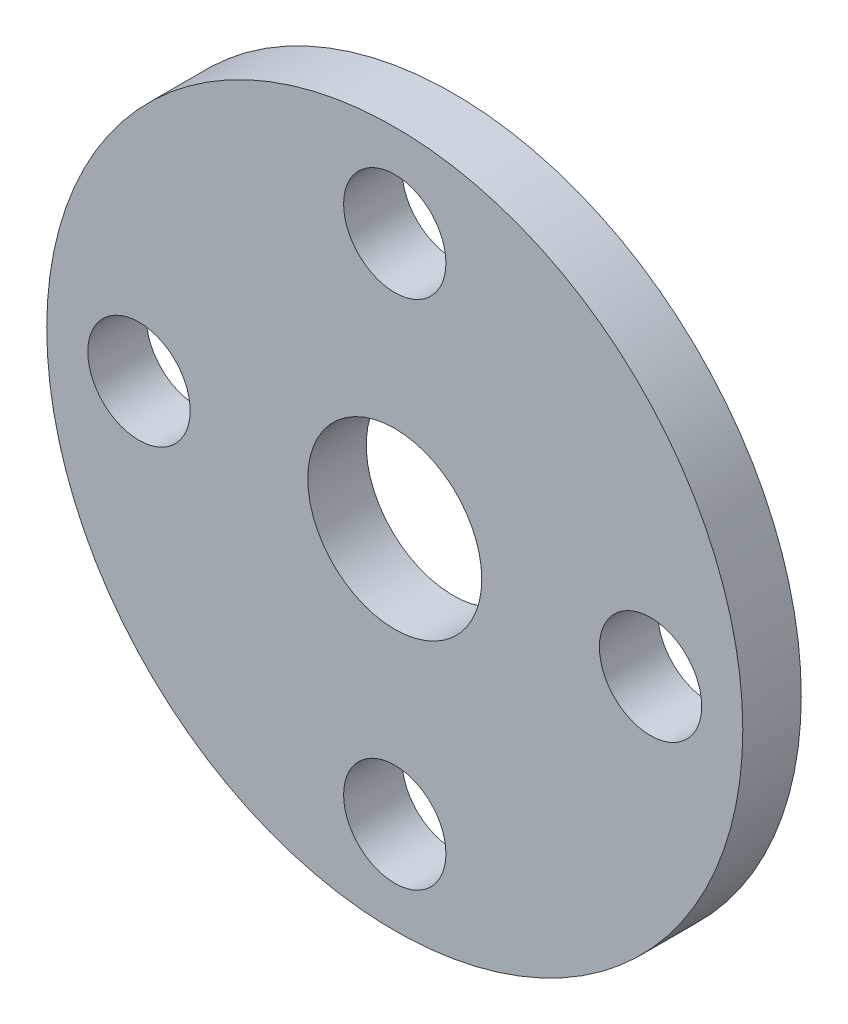
ISO-10303-21;
HEADER;
FILE_DESCRIPTION(('STEP AP214'),'2;1');
FILE_NAME('part.step','',(''),(''),'','','');
FILE_SCHEMA(('AUTOMOTIVE_DESIGN { 1 0 10303 214 1 1 1 1 }'));
ENDSEC;
DATA;
#1=APPLICATION_CONTEXT('core data for automotive mechanical design processes');
#2=APPLICATION_PROTOCOL_DEFINITION('international standard','automotive_design',2000,#1);
#3=PRODUCT_CONTEXT('',#1,'mechanical');
#4=PRODUCT('Part','Part','',(#3));
#5=PRODUCT_RELATED_PRODUCT_CATEGORY('part','',(#4));
#6=PRODUCT_DEFINITION_FORMATION('','',#4);
#7=PRODUCT_DEFINITION_CONTEXT('part definition',#1,'design');
#8=PRODUCT_DEFINITION('design','',#6,#7);
#9=PRODUCT_DEFINITION_SHAPE('','',#8);
#10=(LENGTH_UNIT() NAMED_UNIT(*) SI_UNIT(.MILLI.,.METRE.));
#11=(NAMED_UNIT(*) PLANE_ANGLE_UNIT() SI_UNIT($,.RADIAN.));
#12=(NAMED_UNIT(*) SI_UNIT($,.STERADIAN.) SOLID_ANGLE_UNIT());
#13=UNCERTAINTY_MEASURE_WITH_UNIT(LENGTH_MEASURE(1.E-05),#10,'distance_accuracy_value','');
#14=(GEOMETRIC_REPRESENTATION_CONTEXT(3) GLOBAL_UNCERTAINTY_ASSIGNED_CONTEXT((#13)) GLOBAL_UNIT_ASSIGNED_CONTEXT((#10,
#11,#12)) REPRESENTATION_CONTEXT('',''));
#15=CARTESIAN_POINT('',(0.,0.,0.));
#16=DIRECTION('',(0.,0.,1.));
#17=DIRECTION('',(1.,0.,0.));
#18=AXIS2_PLACEMENT_3D('',#15,#16,#17);
#19=CARTESIAN_POINT('',(0.,0.,-4.7498));
#20=DIRECTION('',(0.,0.,-1.));
#21=DIRECTION('',(-1.,0.,0.));
#22=AXIS2_PLACEMENT_3D('',#19,#20,#21);
#23=PLANE('',#22);
#24=CARTESIAN_POINT('',(0.,0.,-4.7498));
#25=DIRECTION('',(0.,0.,-1.));
#26=DIRECTION('',(-1.,0.,0.));
#27=AXIS2_PLACEMENT_3D('',#24,#25,#26);
#28=CIRCLE('',#27,9.525);
#29=CARTESIAN_POINT('',(-9.525,0.,-4.7498));
#30=VERTEX_POINT('',#29);
#31=EDGE_CURVE('E60',#30,#30,#28,.T.);
#32=ORIENTED_EDGE('',*,*,#31,.F.);
#33=EDGE_LOOP('',(#32));
#34=FACE_BOUND('',#33,.T.);
#35=CARTESIAN_POINT('',(0.,0.,-4.7498));
#36=DIRECTION('',(0.,0.,-1.));
#37=DIRECTION('',(-1.,0.,0.));
#38=AXIS2_PLACEMENT_3D('',#35,#36,#37);
#39=CIRCLE('',#38,2.38125);
#40=CARTESIAN_POINT('',(-2.38125,0.,-4.7498));
#41=VERTEX_POINT('',#40);
#42=EDGE_CURVE('E70',#41,#41,#39,.T.);
#43=ORIENTED_EDGE('',*,*,#42,.T.);
#44=EDGE_LOOP('',(#43));
#45=FACE_BOUND('',#44,.T.);
#46=CARTESIAN_POINT('',(0.,-7.,-4.7498));
#47=DIRECTION('',(0.,0.,-1.));
#48=DIRECTION('',(-1.,0.,0.));
#49=AXIS2_PLACEMENT_3D('',#46,#47,#48);
#50=CIRCLE('',#49,1.4);
#51=CARTESIAN_POINT('',(-1.4,-7.,-4.7498));
#52=VERTEX_POINT('',#51);
#53=EDGE_CURVE('E73',#52,#52,#50,.T.);
#54=ORIENTED_EDGE('',*,*,#53,.T.);
#55=EDGE_LOOP('',(#54));
#56=FACE_BOUND('',#55,.T.);
#57=CARTESIAN_POINT('',(7.,0.,-4.7498));
#58=DIRECTION('',(0.,0.,-1.));
#59=DIRECTION('',(-1.,0.,0.));
#60=AXIS2_PLACEMENT_3D('',#57,#58,#59);
#61=CIRCLE('',#60,1.4);
#62=CARTESIAN_POINT('',(5.6,0.,-4.7498));
#63=VERTEX_POINT('',#62);
#64=EDGE_CURVE('E76',#63,#63,#61,.T.);
#65=ORIENTED_EDGE('',*,*,#64,.T.);
#66=EDGE_LOOP('',(#65));
#67=FACE_BOUND('',#66,.T.);
#68=CARTESIAN_POINT('',(0.,7.,-4.7498));
#69=DIRECTION('',(0.,0.,-1.));
#70=DIRECTION('',(-1.,0.,0.));
#71=AXIS2_PLACEMENT_3D('',#68,#69,#70);
#72=CIRCLE('',#71,1.4);
#73=CARTESIAN_POINT('',(-1.4,7.,-4.7498));
#74=VERTEX_POINT('',#73);
#75=EDGE_CURVE('E79',#74,#74,#72,.T.);
#76=ORIENTED_EDGE('',*,*,#75,.T.);
#77=EDGE_LOOP('',(#76));
#78=FACE_BOUND('',#77,.T.);
#79=CARTESIAN_POINT('',(-7.,0.,-4.7498));
#80=DIRECTION('',(0.,0.,-1.));
#81=DIRECTION('',(-1.,0.,0.));
#82=AXIS2_PLACEMENT_3D('',#79,#80,#81);
#83=CIRCLE('',#82,1.4);
#84=CARTESIAN_POINT('',(-8.4,0.,-4.7498));
#85=VERTEX_POINT('',#84);
#86=EDGE_CURVE('E68',#85,#85,#83,.T.);
#87=ORIENTED_EDGE('',*,*,#86,.T.);
#88=EDGE_LOOP('',(#87));
#89=FACE_BOUND('',#88,.T.);
#90=ADVANCED_FACE('F35',(#34,#45,#56,#67,#78,#89),#23,.F.);
#91=CARTESIAN_POINT('',(0.,0.,-33.2907683632075));
#92=DIRECTION('',(0.,0.,1.));
#93=DIRECTION('',(1.,0.,0.));
#94=AXIS2_PLACEMENT_3D('',#91,#92,#93);
#95=CYLINDRICAL_SURFACE('',#94,9.525);
#96=CARTESIAN_POINT('',(0.,0.,-6.35));
#97=DIRECTION('',(0.,0.,1.));
#98=DIRECTION('',(1.,0.,0.));
#99=AXIS2_PLACEMENT_3D('',#96,#97,#98);
#100=CIRCLE('',#99,9.525);
#101=CARTESIAN_POINT('',(9.525,0.,-6.35));
#102=VERTEX_POINT('',#101);
#103=EDGE_CURVE('E51',#102,#102,#100,.T.);
#104=ORIENTED_EDGE('',*,*,#103,.T.);
#105=EDGE_LOOP('',(#104));
#106=FACE_BOUND('',#105,.T.);
#107=ORIENTED_EDGE('',*,*,#31,.T.);
#108=EDGE_LOOP('',(#107));
#109=FACE_BOUND('',#108,.T.);
#110=ADVANCED_FACE('F97',(#106,#109),#95,.T.);
#111=CARTESIAN_POINT('',(0.,0.,-33.2907683632075));
#112=DIRECTION('',(0.,0.,1.));
#113=DIRECTION('',(1.,0.,0.));
#114=AXIS2_PLACEMENT_3D('',#111,#112,#113);
#115=CYLINDRICAL_SURFACE('',#114,2.38125);
#116=CARTESIAN_POINT('',(0.,0.,-6.35));
#117=DIRECTION('',(0.,0.,1.));
#118=DIRECTION('',(1.,0.,0.));
#119=AXIS2_PLACEMENT_3D('',#116,#117,#118);
#120=CIRCLE('',#119,2.38125);
#121=CARTESIAN_POINT('',(2.38125,0.,-6.35));
#122=VERTEX_POINT('',#121);
#123=EDGE_CURVE('E10',#122,#122,#120,.T.);
#124=ORIENTED_EDGE('',*,*,#123,.F.);
#125=EDGE_LOOP('',(#124));
#126=FACE_BOUND('',#125,.T.);
#127=ORIENTED_EDGE('',*,*,#42,.F.);
#128=EDGE_LOOP('',(#127));
#129=FACE_BOUND('',#128,.T.);
#130=ADVANCED_FACE('F103',(#126,#129),#115,.F.);
#131=CARTESIAN_POINT('',(0.,-7.,-33.2907683632075));
#132=DIRECTION('',(0.,0.,1.));
#133=DIRECTION('',(1.,0.,0.));
#134=AXIS2_PLACEMENT_3D('',#131,#132,#133);
#135=CYLINDRICAL_SURFACE('',#134,1.4);
#136=CARTESIAN_POINT('',(0.,-7.,-6.35));
#137=DIRECTION('',(0.,0.,1.));
#138=DIRECTION('',(1.,0.,0.));
#139=AXIS2_PLACEMENT_3D('',#136,#137,#138);
#140=CIRCLE('',#139,1.4);
#141=CARTESIAN_POINT('',(1.4,-7.,-6.35));
#142=VERTEX_POINT('',#141);
#143=EDGE_CURVE('E43',#142,#142,#140,.T.);
#144=ORIENTED_EDGE('',*,*,#143,.F.);
#145=EDGE_LOOP('',(#144));
#146=FACE_BOUND('',#145,.T.);
#147=ORIENTED_EDGE('',*,*,#53,.F.);
#148=EDGE_LOOP('',(#147));
#149=FACE_BOUND('',#148,.T.);
#150=ADVANCED_FACE('F110',(#146,#149),#135,.F.);
#151=CARTESIAN_POINT('',(7.,0.,-33.2907683632075));
#152=DIRECTION('',(0.,0.,1.));
#153=DIRECTION('',(1.,0.,0.));
#154=AXIS2_PLACEMENT_3D('',#151,#152,#153);
#155=CYLINDRICAL_SURFACE('',#154,1.4);
#156=CARTESIAN_POINT('',(7.,0.,-6.35));
#157=DIRECTION('',(0.,0.,1.));
#158=DIRECTION('',(1.,0.,0.));
#159=AXIS2_PLACEMENT_3D('',#156,#157,#158);
#160=CIRCLE('',#159,1.4);
#161=CARTESIAN_POINT('',(8.4,0.,-6.35));
#162=VERTEX_POINT('',#161);
#163=EDGE_CURVE('E48',#162,#162,#160,.T.);
#164=ORIENTED_EDGE('',*,*,#163,.F.);
#165=EDGE_LOOP('',(#164));
#166=FACE_BOUND('',#165,.T.);
#167=ORIENTED_EDGE('',*,*,#64,.F.);
#168=EDGE_LOOP('',(#167));
#169=FACE_BOUND('',#168,.T.);
#170=ADVANCED_FACE('F93',(#166,#169),#155,.F.);
#171=CARTESIAN_POINT('',(0.,7.,-33.2907683632075));
#172=DIRECTION('',(0.,0.,1.));
#173=DIRECTION('',(1.,0.,0.));
#174=AXIS2_PLACEMENT_3D('',#171,#172,#173);
#175=CYLINDRICAL_SURFACE('',#174,1.4);
#176=CARTESIAN_POINT('',(0.,7.,-6.35));
#177=DIRECTION('',(0.,0.,1.));
#178=DIRECTION('',(1.,0.,0.));
#179=AXIS2_PLACEMENT_3D('',#176,#177,#178);
#180=CIRCLE('',#179,1.4);
#181=CARTESIAN_POINT('',(1.4,7.,-6.35));
#182=VERTEX_POINT('',#181);
#183=EDGE_CURVE('E55',#182,#182,#180,.T.);
#184=ORIENTED_EDGE('',*,*,#183,.F.);
#185=EDGE_LOOP('',(#184));
#186=FACE_BOUND('',#185,.T.);
#187=ORIENTED_EDGE('',*,*,#75,.F.);
#188=EDGE_LOOP('',(#187));
#189=FACE_BOUND('',#188,.T.);
#190=ADVANCED_FACE('F87',(#186,#189),#175,.F.);
#191=CARTESIAN_POINT('',(-7.,0.,-33.2907683632075));
#192=DIRECTION('',(0.,0.,1.));
#193=DIRECTION('',(1.,0.,0.));
#194=AXIS2_PLACEMENT_3D('',#191,#192,#193);
#195=CYLINDRICAL_SURFACE('',#194,1.4);
#196=CARTESIAN_POINT('',(-7.,0.,-6.35));
#197=DIRECTION('',(0.,0.,1.));
#198=DIRECTION('',(1.,0.,0.));
#199=AXIS2_PLACEMENT_3D('',#196,#197,#198);
#200=CIRCLE('',#199,1.4);
#201=CARTESIAN_POINT('',(-5.6,0.,-6.35));
#202=VERTEX_POINT('',#201);
#203=EDGE_CURVE('E39',#202,#202,#200,.T.);
#204=ORIENTED_EDGE('',*,*,#203,.F.);
#205=EDGE_LOOP('',(#204));
#206=FACE_BOUND('',#205,.T.);
#207=ORIENTED_EDGE('',*,*,#86,.F.);
#208=EDGE_LOOP('',(#207));
#209=FACE_BOUND('',#208,.T.);
#210=ADVANCED_FACE('F85',(#206,#209),#195,.F.);
#211=CARTESIAN_POINT('',(0.,0.,-6.35));
#212=DIRECTION('',(0.,0.,1.));
#213=DIRECTION('',(1.,0.,0.));
#214=AXIS2_PLACEMENT_3D('',#211,#212,#213);
#215=PLANE('',#214);
#216=ORIENTED_EDGE('',*,*,#203,.T.);
#217=EDGE_LOOP('',(#216));
#218=FACE_BOUND('',#217,.T.);
#219=ORIENTED_EDGE('',*,*,#183,.T.);
#220=EDGE_LOOP('',(#219));
#221=FACE_BOUND('',#220,.T.);
#222=ORIENTED_EDGE('',*,*,#163,.T.);
#223=EDGE_LOOP('',(#222));
#224=FACE_BOUND('',#223,.T.);
#225=ORIENTED_EDGE('',*,*,#143,.T.);
#226=EDGE_LOOP('',(#225));
#227=FACE_BOUND('',#226,.T.);
#228=ORIENTED_EDGE('',*,*,#123,.T.);
#229=EDGE_LOOP('',(#228));
#230=FACE_BOUND('',#229,.T.);
#231=ORIENTED_EDGE('',*,*,#103,.F.);
#232=EDGE_LOOP('',(#231));
#233=FACE_BOUND('',#232,.T.);
#234=ADVANCED_FACE('F37',(#218,#221,#224,#227,#230,#233),#215,.F.);
#235=CLOSED_SHELL('',(#90,#110,#130,#150,#170,#190,#210,#234));
#236=MANIFOLD_SOLID_BREP('B2',#235);
#237=ADVANCED_BREP_SHAPE_REPRESENTATION('',(#18,#236),#14);
#238=SHAPE_DEFINITION_REPRESENTATION(#9,#237);
ENDSEC;
END-ISO-10303-21;
